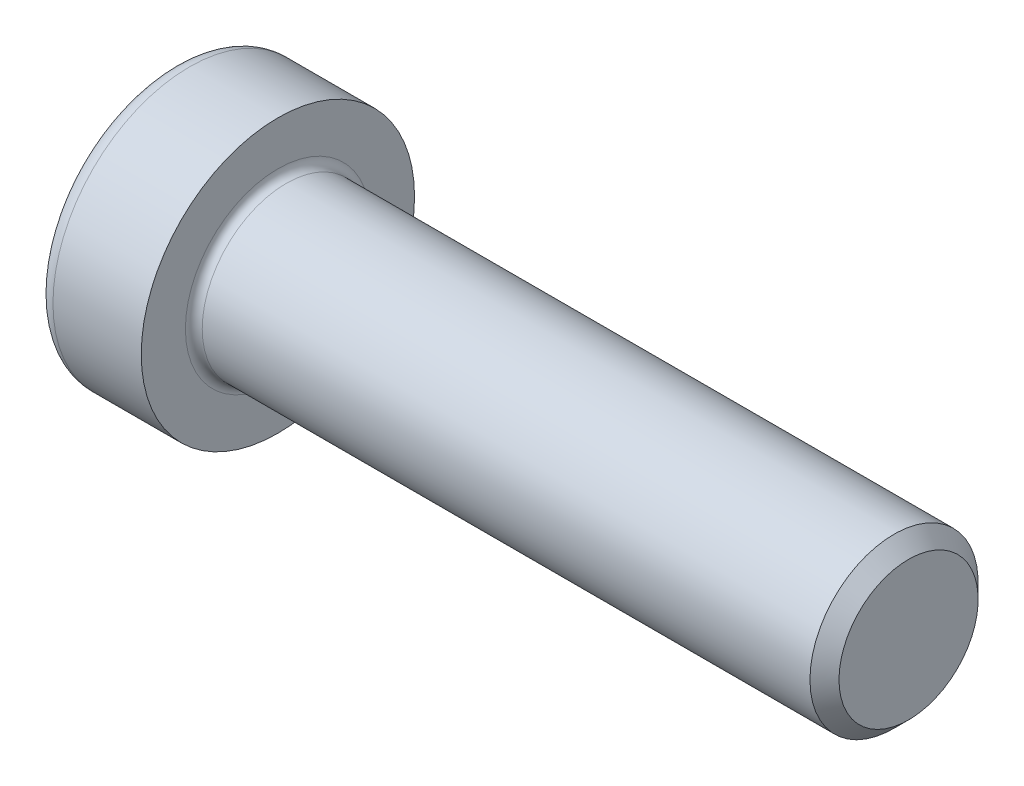
ISO-10303-21;
HEADER;
FILE_DESCRIPTION(('STEP AP214'),'2;1');
FILE_NAME('part.step','',(''),(''),'','','');
FILE_SCHEMA(('AUTOMOTIVE_DESIGN { 1 0 10303 214 1 1 1 1 }'));
ENDSEC;
DATA;
#1=APPLICATION_CONTEXT('core data for automotive mechanical design processes');
#2=APPLICATION_PROTOCOL_DEFINITION('international standard','automotive_design',2000,#1);
#3=PRODUCT_CONTEXT('',#1,'mechanical');
#4=PRODUCT('Part','Part','',(#3));
#5=PRODUCT_RELATED_PRODUCT_CATEGORY('part','',(#4));
#6=PRODUCT_DEFINITION_FORMATION('','',#4);
#7=PRODUCT_DEFINITION_CONTEXT('part definition',#1,'design');
#8=PRODUCT_DEFINITION('design','',#6,#7);
#9=PRODUCT_DEFINITION_SHAPE('','',#8);
#10=(LENGTH_UNIT() NAMED_UNIT(*) SI_UNIT(.MILLI.,.METRE.));
#11=(NAMED_UNIT(*) PLANE_ANGLE_UNIT() SI_UNIT($,.RADIAN.));
#12=(NAMED_UNIT(*) SI_UNIT($,.STERADIAN.) SOLID_ANGLE_UNIT());
#13=UNCERTAINTY_MEASURE_WITH_UNIT(LENGTH_MEASURE(1.E-05),#10,'distance_accuracy_value','');
#14=(GEOMETRIC_REPRESENTATION_CONTEXT(3) GLOBAL_UNCERTAINTY_ASSIGNED_CONTEXT((#13)) GLOBAL_UNIT_ASSIGNED_CONTEXT((#10,
#11,#12)) REPRESENTATION_CONTEXT('',''));
#15=CARTESIAN_POINT('',(0.,0.,0.));
#16=DIRECTION('',(0.,0.,1.));
#17=DIRECTION('',(1.,0.,0.));
#18=AXIS2_PLACEMENT_3D('',#15,#16,#17);
#19=CARTESIAN_POINT('',(0.,0.,0.));
#20=DIRECTION('',(-1.,0.,0.));
#21=DIRECTION('',(0.,0.,1.));
#22=AXIS2_PLACEMENT_3D('',#19,#20,#21);
#23=PLANE('',#22);
#24=DIRECTION('',(0.,-0.499999999999997,0.86602540378444));
#25=VECTOR('',#24,1.);
#26=CARTESIAN_POINT('',(0.,2.88675134594813,0.));
#27=LINE('',#26,#25);
#28=CARTESIAN_POINT('',(0.,2.88675134594813,0.));
#29=VERTEX_POINT('',#28);
#30=CARTESIAN_POINT('',(0.,1.44337567297408,2.49999999999999));
#31=VERTEX_POINT('',#30);
#32=EDGE_CURVE('E270',#29,#31,#27,.T.);
#33=ORIENTED_EDGE('',*,*,#32,.T.);
#34=DIRECTION('',(0.,1.,0.));
#35=VECTOR('',#34,1.);
#36=CARTESIAN_POINT('',(0.,-1.44337567297405,2.5));
#37=LINE('',#36,#35);
#38=CARTESIAN_POINT('',(0.,-1.44337567297405,2.5));
#39=VERTEX_POINT('',#38);
#40=EDGE_CURVE('E131',#39,#31,#37,.T.);
#41=ORIENTED_EDGE('',*,*,#40,.F.);
#42=DIRECTION('',(0.,-0.500000000000001,-0.866025403784438));
#43=VECTOR('',#42,1.);
#44=CARTESIAN_POINT('',(0.,-1.44337567297405,2.5));
#45=LINE('',#44,#43);
#46=CARTESIAN_POINT('',(0.,-2.88675134594812,0.));
#47=VERTEX_POINT('',#46);
#48=EDGE_CURVE('E273',#39,#47,#45,.T.);
#49=ORIENTED_EDGE('',*,*,#48,.T.);
#50=DIRECTION('',(0.,0.499999999999997,-0.86602540378444));
#51=VECTOR('',#50,1.);
#52=CARTESIAN_POINT('',(0.,-2.88675134594812,0.));
#53=LINE('',#52,#51);
#54=CARTESIAN_POINT('',(0.,-1.44337567297406,-2.5));
#55=VERTEX_POINT('',#54);
#56=EDGE_CURVE('E276',#47,#55,#53,.T.);
#57=ORIENTED_EDGE('',*,*,#56,.T.);
#58=DIRECTION('',(0.,-1.,0.));
#59=VECTOR('',#58,1.);
#60=CARTESIAN_POINT('',(0.,1.44337567297407,-2.50000000000001));
#61=LINE('',#60,#59);
#62=CARTESIAN_POINT('',(0.,1.44337567297407,-2.50000000000001));
#63=VERTEX_POINT('',#62);
#64=EDGE_CURVE('E279',#63,#55,#61,.T.);
#65=ORIENTED_EDGE('',*,*,#64,.F.);
#66=DIRECTION('',(0.,-0.500000000000001,-0.866025403784438));
#67=VECTOR('',#66,1.);
#68=CARTESIAN_POINT('',(0.,2.88675134594813,0.));
#69=LINE('',#68,#67);
#70=EDGE_CURVE('E126',#29,#63,#69,.T.);
#71=ORIENTED_EDGE('',*,*,#70,.F.);
#72=EDGE_LOOP('',(#33,#41,#49,#57,#65,#71));
#73=FACE_BOUND('',#72,.T.);
#74=CARTESIAN_POINT('',(0.,0.,0.));
#75=DIRECTION('',(-1.,0.,0.));
#76=DIRECTION('',(0.,0.,1.));
#77=AXIS2_PLACEMENT_3D('',#74,#75,#76);
#78=CIRCLE('',#77,5.7);
#79=CARTESIAN_POINT('',(0.,0.,5.7));
#80=VERTEX_POINT('',#79);
#81=EDGE_CURVE('E47',#80,#80,#78,.T.);
#82=ORIENTED_EDGE('',*,*,#81,.T.);
#83=EDGE_LOOP('',(#82));
#84=FACE_BOUND('',#83,.T.);
#85=ADVANCED_FACE('F39',(#73,#84),#23,.T.);
#86=CARTESIAN_POINT('',(-31.75,0.,0.));
#87=DIRECTION('',(-1.,0.,0.));
#88=DIRECTION('',(0.,0.,1.));
#89=AXIS2_PLACEMENT_3D('',#86,#87,#88);
#90=CYLINDRICAL_SURFACE('',#89,6.5);
#91=CARTESIAN_POINT('',(0.800000000000002,0.,0.));
#92=DIRECTION('',(-1.,0.,0.));
#93=DIRECTION('',(0.,0.,1.));
#94=AXIS2_PLACEMENT_3D('',#91,#92,#93);
#95=CIRCLE('',#94,6.5);
#96=CARTESIAN_POINT('',(0.800000000000002,0.,6.5));
#97=VERTEX_POINT('',#96);
#98=EDGE_CURVE('E11',#97,#97,#95,.F.);
#99=ORIENTED_EDGE('',*,*,#98,.T.);
#100=EDGE_LOOP('',(#99));
#101=FACE_BOUND('',#100,.T.);
#102=CARTESIAN_POINT('',(5.,0.,0.));
#103=DIRECTION('',(-1.,0.,0.));
#104=DIRECTION('',(0.,0.,1.));
#105=AXIS2_PLACEMENT_3D('',#102,#103,#104);
#106=CIRCLE('',#105,6.5);
#107=CARTESIAN_POINT('',(5.,0.,6.5));
#108=VERTEX_POINT('',#107);
#109=EDGE_CURVE('E149',#108,#108,#106,.T.);
#110=ORIENTED_EDGE('',*,*,#109,.T.);
#111=EDGE_LOOP('',(#110));
#112=FACE_BOUND('',#111,.T.);
#113=ADVANCED_FACE('F173',(#101,#112),#90,.T.);
#114=CARTESIAN_POINT('',(5.,6.5,0.));
#115=DIRECTION('',(1.,0.,0.));
#116=DIRECTION('',(0.,0.,-1.));
#117=AXIS2_PLACEMENT_3D('',#114,#115,#116);
#118=PLANE('',#117);
#119=CARTESIAN_POINT('',(5.,0.,0.));
#120=DIRECTION('',(1.,0.,0.));
#121=DIRECTION('',(0.,0.,-1.));
#122=AXIS2_PLACEMENT_3D('',#119,#120,#121);
#123=CIRCLE('',#122,4.39999999999999);
#124=CARTESIAN_POINT('',(5.,0.,-4.39999999999999));
#125=VERTEX_POINT('',#124);
#126=EDGE_CURVE('E152',#125,#125,#123,.F.);
#127=ORIENTED_EDGE('',*,*,#126,.T.);
#128=EDGE_LOOP('',(#127));
#129=FACE_BOUND('',#128,.T.);
#130=ORIENTED_EDGE('',*,*,#109,.F.);
#131=EDGE_LOOP('',(#130));
#132=FACE_BOUND('',#131,.T.);
#133=ADVANCED_FACE('F179',(#129,#132),#118,.T.);
#134=CARTESIAN_POINT('',(-31.75,0.,0.));
#135=DIRECTION('',(-1.,0.,0.));
#136=DIRECTION('',(0.,0.,1.));
#137=AXIS2_PLACEMENT_3D('',#134,#135,#136);
#138=CYLINDRICAL_SURFACE('',#137,3.99999999999999);
#139=CARTESIAN_POINT('',(5.4,0.,0.));
#140=DIRECTION('',(1.,0.,0.));
#141=DIRECTION('',(0.,0.,-1.));
#142=AXIS2_PLACEMENT_3D('',#139,#140,#141);
#143=CIRCLE('',#142,3.99999999999999);
#144=CARTESIAN_POINT('',(5.4,0.,-3.99999999999999));
#145=VERTEX_POINT('',#144);
#146=EDGE_CURVE('E155',#145,#145,#143,.T.);
#147=ORIENTED_EDGE('',*,*,#146,.T.);
#148=EDGE_LOOP('',(#147));
#149=FACE_BOUND('',#148,.T.);
#150=CARTESIAN_POINT('',(34.3095,0.,0.));
#151=DIRECTION('',(-1.,0.,0.));
#152=DIRECTION('',(0.,0.,1.));
#153=AXIS2_PLACEMENT_3D('',#150,#151,#152);
#154=CIRCLE('',#153,3.99999999999998);
#155=CARTESIAN_POINT('',(34.3095,0.,3.99999999999998));
#156=VERTEX_POINT('',#155);
#157=EDGE_CURVE('E146',#156,#156,#154,.T.);
#158=ORIENTED_EDGE('',*,*,#157,.T.);
#159=EDGE_LOOP('',(#158));
#160=FACE_BOUND('',#159,.T.);
#161=ADVANCED_FACE('F185',(#149,#160),#138,.T.);
#162=CARTESIAN_POINT('',(35.,0.,0.));
#163=DIRECTION('',(-1.,0.,0.));
#164=DIRECTION('',(0.,0.,1.));
#165=AXIS2_PLACEMENT_3D('',#162,#163,#164);
#166=CONICAL_SURFACE('',#165,3.3095,0.785398163397428);
#167=ORIENTED_EDGE('',*,*,#157,.F.);
#168=EDGE_LOOP('',(#167));
#169=FACE_BOUND('',#168,.T.);
#170=CARTESIAN_POINT('',(35.,0.,0.));
#171=DIRECTION('',(-1.,0.,0.));
#172=DIRECTION('',(0.,0.,1.));
#173=AXIS2_PLACEMENT_3D('',#170,#171,#172);
#174=CIRCLE('',#173,3.3095);
#175=CARTESIAN_POINT('',(35.,0.,3.3095));
#176=VERTEX_POINT('',#175);
#177=EDGE_CURVE('E142',#176,#176,#174,.T.);
#178=ORIENTED_EDGE('',*,*,#177,.T.);
#179=EDGE_LOOP('',(#178));
#180=FACE_BOUND('',#179,.T.);
#181=ADVANCED_FACE('F189',(#169,#180),#166,.T.);
#182=CARTESIAN_POINT('',(35.,3.3095,0.));
#183=DIRECTION('',(1.,0.,0.));
#184=DIRECTION('',(0.,0.,-1.));
#185=AXIS2_PLACEMENT_3D('',#182,#183,#184);
#186=PLANE('',#185);
#187=ORIENTED_EDGE('',*,*,#177,.F.);
#188=EDGE_LOOP('',(#187));
#189=FACE_BOUND('',#188,.T.);
#190=ADVANCED_FACE('F169',(#189),#186,.T.);
#191=CARTESIAN_POINT('',(5.4,0.,0.));
#192=DIRECTION('',(1.,0.,0.));
#193=DIRECTION('',(0.,0.,-1.));
#194=AXIS2_PLACEMENT_3D('',#191,#192,#193);
#195=TOROIDAL_SURFACE('',#194,4.39999999999999,0.4);
#196=ORIENTED_EDGE('',*,*,#146,.F.);
#197=EDGE_LOOP('',(#196));
#198=FACE_BOUND('',#197,.T.);
#199=ORIENTED_EDGE('',*,*,#126,.F.);
#200=EDGE_LOOP('',(#199));
#201=FACE_BOUND('',#200,.T.);
#202=ADVANCED_FACE('F162',(#198,#201),#195,.F.);
#203=CARTESIAN_POINT('',(0.800000000000002,0.,0.));
#204=DIRECTION('',(-1.,0.,0.));
#205=DIRECTION('',(0.,0.,1.));
#206=AXIS2_PLACEMENT_3D('',#203,#204,#205);
#207=TOROIDAL_SURFACE('',#206,5.7,0.8);
#208=ORIENTED_EDGE('',*,*,#98,.F.);
#209=EDGE_LOOP('',(#208));
#210=FACE_BOUND('',#209,.T.);
#211=ORIENTED_EDGE('',*,*,#81,.F.);
#212=EDGE_LOOP('',(#211));
#213=FACE_BOUND('',#212,.T.);
#214=ADVANCED_FACE('F41',(#210,#213),#207,.T.);
#215=CARTESIAN_POINT('',(3.8,2.88675134594813,0.));
#216=DIRECTION('',(0.,-0.86602540378444,-0.499999999999997));
#217=DIRECTION('',(0.,0.499999999999998,-0.86602540378444));
#218=AXIS2_PLACEMENT_3D('',#215,#216,#217);
#219=PLANE('',#218);
#220=ORIENTED_EDGE('',*,*,#32,.F.);
#221=DIRECTION('',(-1.,0.,0.));
#222=VECTOR('',#221,1.);
#223=CARTESIAN_POINT('',(3.8,2.88675134594813,0.));
#224=LINE('',#223,#222);
#225=CARTESIAN_POINT('',(3.8,2.88675134594813,0.));
#226=VERTEX_POINT('',#225);
#227=EDGE_CURVE('E269',#226,#29,#224,.T.);
#228=ORIENTED_EDGE('',*,*,#227,.F.);
#229=DIRECTION('',(0.,-0.499999999999997,0.86602540378444));
#230=VECTOR('',#229,1.);
#231=CARTESIAN_POINT('',(3.8,2.88675134594813,0.));
#232=LINE('',#231,#230);
#233=CARTESIAN_POINT('',(3.8,2.1650635094611,1.24999999999999));
#234=VERTEX_POINT('',#233);
#235=EDGE_CURVE('E54',#226,#234,#232,.T.);
#236=ORIENTED_EDGE('',*,*,#235,.T.);
#237=CARTESIAN_POINT('',(3.8,1.44337567297408,2.49999999999999));
#238=VERTEX_POINT('',#237);
#239=EDGE_CURVE('E112',#234,#238,#232,.T.);
#240=ORIENTED_EDGE('',*,*,#239,.T.);
#241=DIRECTION('',(-1.,0.,0.));
#242=VECTOR('',#241,1.);
#243=CARTESIAN_POINT('',(3.8,1.44337567297408,2.49999999999999));
#244=LINE('',#243,#242);
#245=EDGE_CURVE('E124',#238,#31,#244,.T.);
#246=ORIENTED_EDGE('',*,*,#245,.T.);
#247=EDGE_LOOP('',(#220,#228,#236,#240,#246));
#248=FACE_BOUND('',#247,.T.);
#249=ADVANCED_FACE('F123',(#248),#219,.T.);
#250=CARTESIAN_POINT('',(3.8,-1.44337567297405,2.5));
#251=DIRECTION('',(0.,0.,1.));
#252=DIRECTION('',(0.,-1.,0.));
#253=AXIS2_PLACEMENT_3D('',#250,#251,#252);
#254=PLANE('',#253);
#255=ORIENTED_EDGE('',*,*,#40,.T.);
#256=ORIENTED_EDGE('',*,*,#245,.F.);
#257=DIRECTION('',(0.,1.,0.));
#258=VECTOR('',#257,1.);
#259=CARTESIAN_POINT('',(3.8,-1.44337567297405,2.5));
#260=LINE('',#259,#258);
#261=CARTESIAN_POINT('',(3.8,0.,2.5));
#262=VERTEX_POINT('',#261);
#263=EDGE_CURVE('E110',#262,#238,#260,.T.);
#264=ORIENTED_EDGE('',*,*,#263,.F.);
#265=CARTESIAN_POINT('',(3.8,-1.44337567297405,2.5));
#266=VERTEX_POINT('',#265);
#267=EDGE_CURVE('E120',#266,#262,#260,.T.);
#268=ORIENTED_EDGE('',*,*,#267,.F.);
#269=DIRECTION('',(-1.,0.,0.));
#270=VECTOR('',#269,1.);
#271=CARTESIAN_POINT('',(3.8,-1.44337567297405,2.5));
#272=LINE('',#271,#270);
#273=EDGE_CURVE('E133',#266,#39,#272,.T.);
#274=ORIENTED_EDGE('',*,*,#273,.T.);
#275=EDGE_LOOP('',(#255,#256,#264,#268,#274));
#276=FACE_BOUND('',#275,.T.);
#277=ADVANCED_FACE('F128',(#276),#254,.F.);
#278=CARTESIAN_POINT('',(3.8,-1.44337567297405,2.5));
#279=DIRECTION('',(0.,0.866025403784438,-0.500000000000001));
#280=DIRECTION('',(0.,0.500000000000001,0.866025403784438));
#281=AXIS2_PLACEMENT_3D('',#278,#279,#280);
#282=PLANE('',#281);
#283=ORIENTED_EDGE('',*,*,#48,.F.);
#284=ORIENTED_EDGE('',*,*,#273,.F.);
#285=DIRECTION('',(0.,-0.500000000000001,-0.866025403784438));
#286=VECTOR('',#285,1.);
#287=CARTESIAN_POINT('',(3.8,-1.44337567297405,2.5));
#288=LINE('',#287,#286);
#289=CARTESIAN_POINT('',(3.8,-2.16506350946109,1.25));
#290=VERTEX_POINT('',#289);
#291=EDGE_CURVE('E250',#266,#290,#288,.T.);
#292=ORIENTED_EDGE('',*,*,#291,.T.);
#293=CARTESIAN_POINT('',(3.8,-2.88675134594812,0.));
#294=VERTEX_POINT('',#293);
#295=EDGE_CURVE('E252',#290,#294,#288,.T.);
#296=ORIENTED_EDGE('',*,*,#295,.T.);
#297=DIRECTION('',(-1.,0.,0.));
#298=VECTOR('',#297,1.);
#299=CARTESIAN_POINT('',(3.8,-2.88675134594812,0.));
#300=LINE('',#299,#298);
#301=EDGE_CURVE('E138',#294,#47,#300,.T.);
#302=ORIENTED_EDGE('',*,*,#301,.T.);
#303=EDGE_LOOP('',(#283,#284,#292,#296,#302));
#304=FACE_BOUND('',#303,.T.);
#305=ADVANCED_FACE('F202',(#304),#282,.T.);
#306=CARTESIAN_POINT('',(3.8,-2.88675134594812,0.));
#307=DIRECTION('',(0.,0.86602540378444,0.499999999999997));
#308=DIRECTION('',(0.,-0.499999999999998,0.86602540378444));
#309=AXIS2_PLACEMENT_3D('',#306,#307,#308);
#310=PLANE('',#309);
#311=ORIENTED_EDGE('',*,*,#56,.F.);
#312=ORIENTED_EDGE('',*,*,#301,.F.);
#313=DIRECTION('',(0.,0.499999999999997,-0.86602540378444));
#314=VECTOR('',#313,1.);
#315=CARTESIAN_POINT('',(3.8,-2.88675134594812,0.));
#316=LINE('',#315,#314);
#317=CARTESIAN_POINT('',(3.8,-2.1650635094611,-1.24999999999999));
#318=VERTEX_POINT('',#317);
#319=EDGE_CURVE('E255',#294,#318,#316,.T.);
#320=ORIENTED_EDGE('',*,*,#319,.T.);
#321=CARTESIAN_POINT('',(3.8,-1.44337567297406,-2.5));
#322=VERTEX_POINT('',#321);
#323=EDGE_CURVE('E259',#318,#322,#316,.T.);
#324=ORIENTED_EDGE('',*,*,#323,.T.);
#325=DIRECTION('',(-1.,0.,0.));
#326=VECTOR('',#325,1.);
#327=CARTESIAN_POINT('',(3.8,-1.44337567297406,-2.5));
#328=LINE('',#327,#326);
#329=EDGE_CURVE('E288',#322,#55,#328,.T.);
#330=ORIENTED_EDGE('',*,*,#329,.T.);
#331=EDGE_LOOP('',(#311,#312,#320,#324,#330));
#332=FACE_BOUND('',#331,.T.);
#333=ADVANCED_FACE('F205',(#332),#310,.T.);
#334=CARTESIAN_POINT('',(3.8,1.44337567297407,-2.50000000000001));
#335=DIRECTION('',(0.,0.,-1.));
#336=DIRECTION('',(0.,1.,0.));
#337=AXIS2_PLACEMENT_3D('',#334,#335,#336);
#338=PLANE('',#337);
#339=ORIENTED_EDGE('',*,*,#64,.T.);
#340=ORIENTED_EDGE('',*,*,#329,.F.);
#341=DIRECTION('',(0.,-1.,0.));
#342=VECTOR('',#341,1.);
#343=CARTESIAN_POINT('',(3.8,1.44337567297407,-2.50000000000001));
#344=LINE('',#343,#342);
#345=CARTESIAN_POINT('',(3.8,0.,-2.50000000000001));
#346=VERTEX_POINT('',#345);
#347=EDGE_CURVE('E263',#346,#322,#344,.T.);
#348=ORIENTED_EDGE('',*,*,#347,.F.);
#349=CARTESIAN_POINT('',(3.8,1.44337567297407,-2.50000000000001));
#350=VERTEX_POINT('',#349);
#351=EDGE_CURVE('E264',#350,#346,#344,.T.);
#352=ORIENTED_EDGE('',*,*,#351,.F.);
#353=DIRECTION('',(-1.,0.,0.));
#354=VECTOR('',#353,1.);
#355=CARTESIAN_POINT('',(3.8,1.44337567297407,-2.50000000000001));
#356=LINE('',#355,#354);
#357=EDGE_CURVE('E285',#350,#63,#356,.T.);
#358=ORIENTED_EDGE('',*,*,#357,.T.);
#359=EDGE_LOOP('',(#339,#340,#348,#352,#358));
#360=FACE_BOUND('',#359,.T.);
#361=ADVANCED_FACE('F209',(#360),#338,.F.);
#362=CARTESIAN_POINT('',(3.8,2.88675134594813,0.));
#363=DIRECTION('',(0.,0.866025403784438,-0.500000000000001));
#364=DIRECTION('',(0.,0.500000000000001,0.866025403784438));
#365=AXIS2_PLACEMENT_3D('',#362,#363,#364);
#366=PLANE('',#365);
#367=ORIENTED_EDGE('',*,*,#70,.T.);
#368=ORIENTED_EDGE('',*,*,#357,.F.);
#369=DIRECTION('',(0.,-0.500000000000001,-0.866025403784438));
#370=VECTOR('',#369,1.);
#371=CARTESIAN_POINT('',(3.8,2.88675134594813,0.));
#372=LINE('',#371,#370);
#373=CARTESIAN_POINT('',(3.8,2.1650635094611,-1.25000000000001));
#374=VERTEX_POINT('',#373);
#375=EDGE_CURVE('E267',#374,#350,#372,.T.);
#376=ORIENTED_EDGE('',*,*,#375,.F.);
#377=EDGE_CURVE('E241',#226,#374,#372,.T.);
#378=ORIENTED_EDGE('',*,*,#377,.F.);
#379=ORIENTED_EDGE('',*,*,#227,.T.);
#380=EDGE_LOOP('',(#367,#368,#376,#378,#379));
#381=FACE_BOUND('',#380,.T.);
#382=ADVANCED_FACE('F213',(#381),#366,.F.);
#383=CARTESIAN_POINT('',(3.8,1.44337567297408,2.49999999999999));
#384=DIRECTION('',(-1.,0.,0.));
#385=DIRECTION('',(0.,0.,1.));
#386=AXIS2_PLACEMENT_3D('',#383,#384,#385);
#387=PLANE('',#386);
#388=CARTESIAN_POINT('',(3.8,0.,0.));
#389=DIRECTION('',(-1.,0.,0.));
#390=DIRECTION('',(0.,0.,1.));
#391=AXIS2_PLACEMENT_3D('',#388,#389,#390);
#392=CIRCLE('',#391,2.5);
#393=EDGE_CURVE('E132',#290,#262,#392,.T.);
#394=ORIENTED_EDGE('',*,*,#393,.F.);
#395=ORIENTED_EDGE('',*,*,#291,.F.);
#396=ORIENTED_EDGE('',*,*,#267,.T.);
#397=EDGE_LOOP('',(#394,#395,#396));
#398=FACE_BOUND('',#397,.T.);
#399=ADVANCED_FACE('F217',(#398),#387,.T.);
#400=EDGE_CURVE('E136',#318,#290,#392,.T.);
#401=ORIENTED_EDGE('',*,*,#400,.F.);
#402=ORIENTED_EDGE('',*,*,#319,.F.);
#403=ORIENTED_EDGE('',*,*,#295,.F.);
#404=EDGE_LOOP('',(#401,#402,#403));
#405=FACE_BOUND('',#404,.T.);
#406=ADVANCED_FACE('F220',(#405),#387,.T.);
#407=EDGE_CURVE('E294',#346,#318,#392,.T.);
#408=ORIENTED_EDGE('',*,*,#407,.F.);
#409=ORIENTED_EDGE('',*,*,#347,.T.);
#410=ORIENTED_EDGE('',*,*,#323,.F.);
#411=EDGE_LOOP('',(#408,#409,#410));
#412=FACE_BOUND('',#411,.T.);
#413=ADVANCED_FACE('F225',(#412),#387,.T.);
#414=EDGE_CURVE('E244',#374,#346,#392,.T.);
#415=ORIENTED_EDGE('',*,*,#414,.F.);
#416=ORIENTED_EDGE('',*,*,#375,.T.);
#417=ORIENTED_EDGE('',*,*,#351,.T.);
#418=EDGE_LOOP('',(#415,#416,#417));
#419=FACE_BOUND('',#418,.T.);
#420=ADVANCED_FACE('F232',(#419),#387,.T.);
#421=EDGE_CURVE('E143',#234,#374,#392,.T.);
#422=ORIENTED_EDGE('',*,*,#421,.F.);
#423=ORIENTED_EDGE('',*,*,#235,.F.);
#424=ORIENTED_EDGE('',*,*,#377,.T.);
#425=EDGE_LOOP('',(#422,#423,#424));
#426=FACE_BOUND('',#425,.T.);
#427=ADVANCED_FACE('F228',(#426),#387,.T.);
#428=EDGE_CURVE('E115',#262,#234,#392,.T.);
#429=ORIENTED_EDGE('',*,*,#428,.F.);
#430=ORIENTED_EDGE('',*,*,#263,.T.);
#431=ORIENTED_EDGE('',*,*,#239,.F.);
#432=EDGE_LOOP('',(#429,#430,#431));
#433=FACE_BOUND('',#432,.T.);
#434=ADVANCED_FACE('F111',(#433),#387,.T.);
#435=CARTESIAN_POINT('',(3.8,0.,0.));
#436=DIRECTION('',(-1.,0.,0.));
#437=DIRECTION('',(0.,0.,1.));
#438=AXIS2_PLACEMENT_3D('',#435,#436,#437);
#439=CONICAL_SURFACE('',#438,2.5,1.04719755119659);
#440=CARTESIAN_POINT('',(5.24337567297407,0.,0.));
#441=VERTEX_POINT('',#440);
#442=VERTEX_LOOP('',#441);
#443=FACE_BOUND('',#442,.T.);
#444=ORIENTED_EDGE('',*,*,#428,.T.);
#445=ORIENTED_EDGE('',*,*,#421,.T.);
#446=ORIENTED_EDGE('',*,*,#414,.T.);
#447=ORIENTED_EDGE('',*,*,#407,.T.);
#448=ORIENTED_EDGE('',*,*,#400,.T.);
#449=ORIENTED_EDGE('',*,*,#393,.T.);
#450=EDGE_LOOP('',(#444,#445,#446,#447,#448,#449));
#451=FACE_BOUND('',#450,.T.);
#452=ADVANCED_FACE('F197',(#443,#451),#439,.F.);
#453=CLOSED_SHELL('',(#85,#113,#133,#161,#181,#190,#202,#214,#249,#277,#305,#333,#361,#382,#399,
#406,#413,#420,#427,#434,#452));
#454=MANIFOLD_SOLID_BREP('B2',#453);
#455=ADVANCED_BREP_SHAPE_REPRESENTATION('',(#18,#454),#14);
#456=SHAPE_DEFINITION_REPRESENTATION(#9,#455);
ENDSEC;
END-ISO-10303-21;
